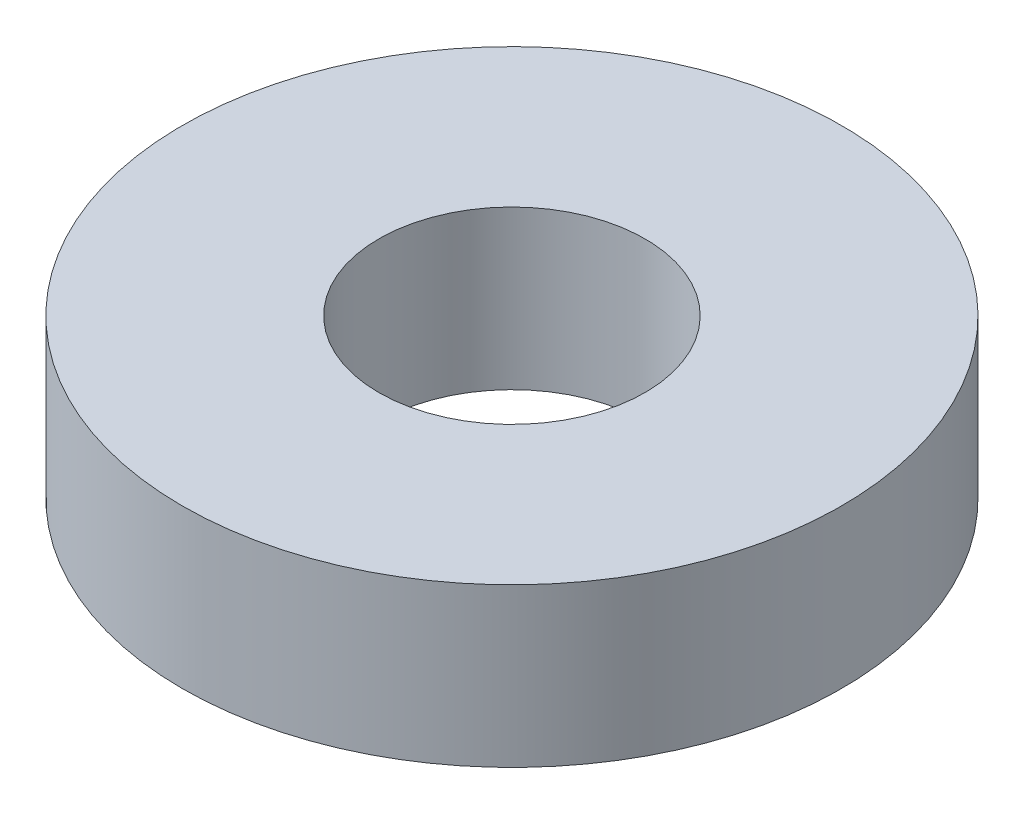
ISO-10303-21;
HEADER;
FILE_DESCRIPTION(('STEP AP214'),'2;1');
FILE_NAME('part.step','',(''),(''),'','','');
FILE_SCHEMA(('AUTOMOTIVE_DESIGN { 1 0 10303 214 1 1 1 1 }'));
ENDSEC;
DATA;
#1=APPLICATION_CONTEXT('core data for automotive mechanical design processes');
#2=APPLICATION_PROTOCOL_DEFINITION('international standard','automotive_design',2000,#1);
#3=PRODUCT_CONTEXT('',#1,'mechanical');
#4=PRODUCT('Part','Part','',(#3));
#5=PRODUCT_RELATED_PRODUCT_CATEGORY('part','',(#4));
#6=PRODUCT_DEFINITION_FORMATION('','',#4);
#7=PRODUCT_DEFINITION_CONTEXT('part definition',#1,'design');
#8=PRODUCT_DEFINITION('design','',#6,#7);
#9=PRODUCT_DEFINITION_SHAPE('','',#8);
#10=(LENGTH_UNIT() NAMED_UNIT(*) SI_UNIT(.MILLI.,.METRE.));
#11=(NAMED_UNIT(*) PLANE_ANGLE_UNIT() SI_UNIT($,.RADIAN.));
#12=(NAMED_UNIT(*) SI_UNIT($,.STERADIAN.) SOLID_ANGLE_UNIT());
#13=UNCERTAINTY_MEASURE_WITH_UNIT(LENGTH_MEASURE(1.E-05),#10,'distance_accuracy_value','');
#14=(GEOMETRIC_REPRESENTATION_CONTEXT(3) GLOBAL_UNCERTAINTY_ASSIGNED_CONTEXT((#13)) GLOBAL_UNIT_ASSIGNED_CONTEXT((#10,
#11,#12)) REPRESENTATION_CONTEXT('',''));
#15=CARTESIAN_POINT('',(0.,0.,0.));
#16=DIRECTION('',(0.,0.,1.));
#17=DIRECTION('',(1.,0.,0.));
#18=AXIS2_PLACEMENT_3D('',#15,#16,#17);
#19=CARTESIAN_POINT('',(-393.068007622806,-352.273993716628,126.155243161511));
#20=DIRECTION('',(0.,1.,0.));
#21=DIRECTION('',(0.,0.,1.));
#22=AXIS2_PLACEMENT_3D('',#19,#20,#21);
#23=PLANE('',#22);
#24=CARTESIAN_POINT('',(-384.068007622806,-352.273993716628,110.155243161511));
#25=DIRECTION('',(0.,1.,0.));
#26=DIRECTION('',(0.,0.,1.));
#27=AXIS2_PLACEMENT_3D('',#24,#25,#26);
#28=CIRCLE('',#27,5.05000000000001);
#29=CARTESIAN_POINT('',(-384.068007622806,-352.273993716628,115.205243161511));
#30=VERTEX_POINT('',#29);
#31=EDGE_CURVE('E41',#30,#30,#28,.T.);
#32=ORIENTED_EDGE('',*,*,#31,.F.);
#33=EDGE_LOOP('',(#32));
#34=FACE_BOUND('',#33,.T.);
#35=CARTESIAN_POINT('',(-384.068007622806,-352.273993716628,110.155243161511));
#36=DIRECTION('',(0.,1.,0.));
#37=DIRECTION('',(0.,0.,1.));
#38=AXIS2_PLACEMENT_3D('',#35,#36,#37);
#39=CIRCLE('',#38,12.5);
#40=CARTESIAN_POINT('',(-384.068007622806,-352.273993716628,122.655243161511));
#41=VERTEX_POINT('',#40);
#42=EDGE_CURVE('E47',#41,#41,#39,.T.);
#43=ORIENTED_EDGE('',*,*,#42,.T.);
#44=EDGE_LOOP('',(#43));
#45=FACE_BOUND('',#44,.T.);
#46=ADVANCED_FACE('F33',(#34,#45),#23,.T.);
#47=CARTESIAN_POINT('',(-393.068007622806,-358.273993716628,126.155243161511));
#48=DIRECTION('',(0.,1.,0.));
#49=DIRECTION('',(0.,0.,1.));
#50=AXIS2_PLACEMENT_3D('',#47,#48,#49);
#51=PLANE('',#50);
#52=CARTESIAN_POINT('',(-384.068007622806,-358.273993716628,110.155243161511));
#53=DIRECTION('',(0.,1.,0.));
#54=DIRECTION('',(0.,0.,1.));
#55=AXIS2_PLACEMENT_3D('',#52,#53,#54);
#56=CIRCLE('',#55,5.05000000000001);
#57=CARTESIAN_POINT('',(-384.068007622806,-358.273993716628,115.205243161511));
#58=VERTEX_POINT('',#57);
#59=EDGE_CURVE('E11',#58,#58,#56,.T.);
#60=ORIENTED_EDGE('',*,*,#59,.T.);
#61=EDGE_LOOP('',(#60));
#62=FACE_BOUND('',#61,.T.);
#63=CARTESIAN_POINT('',(-384.068007622806,-358.273993716628,110.155243161511));
#64=DIRECTION('',(0.,1.,0.));
#65=DIRECTION('',(0.,0.,1.));
#66=AXIS2_PLACEMENT_3D('',#63,#64,#65);
#67=CIRCLE('',#66,12.5);
#68=CARTESIAN_POINT('',(-384.068007622806,-358.273993716628,122.655243161511));
#69=VERTEX_POINT('',#68);
#70=EDGE_CURVE('E37',#69,#69,#67,.T.);
#71=ORIENTED_EDGE('',*,*,#70,.F.);
#72=EDGE_LOOP('',(#71));
#73=FACE_BOUND('',#72,.T.);
#74=ADVANCED_FACE('F35',(#62,#73),#51,.F.);
#75=CARTESIAN_POINT('',(-384.068007622806,-358.273993716628,110.155243161511));
#76=DIRECTION('',(0.,1.,0.));
#77=DIRECTION('',(0.,0.,1.));
#78=AXIS2_PLACEMENT_3D('',#75,#76,#77);
#79=CYLINDRICAL_SURFACE('',#78,5.05000000000001);
#80=ORIENTED_EDGE('',*,*,#59,.F.);
#81=EDGE_LOOP('',(#80));
#82=FACE_BOUND('',#81,.T.);
#83=ORIENTED_EDGE('',*,*,#31,.T.);
#84=EDGE_LOOP('',(#83));
#85=FACE_BOUND('',#84,.T.);
#86=ADVANCED_FACE('F57',(#82,#85),#79,.F.);
#87=CARTESIAN_POINT('',(-384.068007622806,-362.273993716628,110.155243161511));
#88=DIRECTION('',(0.,1.,0.));
#89=DIRECTION('',(0.,0.,1.));
#90=AXIS2_PLACEMENT_3D('',#87,#88,#89);
#91=CYLINDRICAL_SURFACE('',#90,12.5);
#92=ORIENTED_EDGE('',*,*,#42,.F.);
#93=EDGE_LOOP('',(#92));
#94=FACE_BOUND('',#93,.T.);
#95=ORIENTED_EDGE('',*,*,#70,.T.);
#96=EDGE_LOOP('',(#95));
#97=FACE_BOUND('',#96,.T.);
#98=ADVANCED_FACE('F54',(#94,#97),#91,.T.);
#99=CLOSED_SHELL('',(#46,#74,#86,#98));
#100=MANIFOLD_SOLID_BREP('B2',#99);
#101=ADVANCED_BREP_SHAPE_REPRESENTATION('',(#18,#100),#14);
#102=SHAPE_DEFINITION_REPRESENTATION(#9,#101);
ENDSEC;
END-ISO-10303-21;
